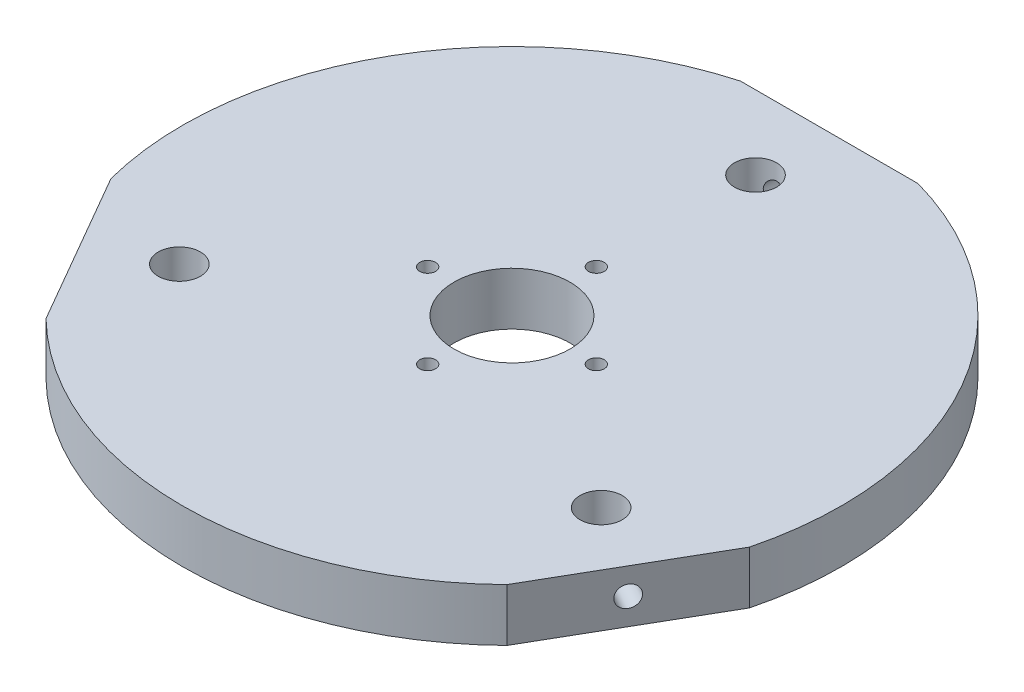
ISO-10303-21;
HEADER;
FILE_DESCRIPTION(('STEP AP214'),'2;1');
FILE_NAME('part.step','',(''),(''),'','','');
FILE_SCHEMA(('AUTOMOTIVE_DESIGN { 1 0 10303 214 1 1 1 1 }'));
ENDSEC;
DATA;
#1=APPLICATION_CONTEXT('core data for automotive mechanical design processes');
#2=APPLICATION_PROTOCOL_DEFINITION('international standard','automotive_design',2000,#1);
#3=PRODUCT_CONTEXT('',#1,'mechanical');
#4=PRODUCT('Part','Part','',(#3));
#5=PRODUCT_RELATED_PRODUCT_CATEGORY('part','',(#4));
#6=PRODUCT_DEFINITION_FORMATION('','',#4);
#7=PRODUCT_DEFINITION_CONTEXT('part definition',#1,'design');
#8=PRODUCT_DEFINITION('design','',#6,#7);
#9=PRODUCT_DEFINITION_SHAPE('','',#8);
#10=(LENGTH_UNIT() NAMED_UNIT(*) SI_UNIT(.MILLI.,.METRE.));
#11=(NAMED_UNIT(*) PLANE_ANGLE_UNIT() SI_UNIT($,.RADIAN.));
#12=(NAMED_UNIT(*) SI_UNIT($,.STERADIAN.) SOLID_ANGLE_UNIT());
#13=UNCERTAINTY_MEASURE_WITH_UNIT(LENGTH_MEASURE(1.E-05),#10,'distance_accuracy_value','');
#14=(GEOMETRIC_REPRESENTATION_CONTEXT(3) GLOBAL_UNCERTAINTY_ASSIGNED_CONTEXT((#13)) GLOBAL_UNIT_ASSIGNED_CONTEXT((#10,
#11,#12)) REPRESENTATION_CONTEXT('',''));
#15=CARTESIAN_POINT('',(0.,0.,0.));
#16=DIRECTION('',(0.,0.,1.));
#17=DIRECTION('',(1.,0.,0.));
#18=AXIS2_PLACEMENT_3D('',#15,#16,#17);
#19=CARTESIAN_POINT('',(0.,10.,0.));
#20=DIRECTION('',(0.,-1.,0.));
#21=DIRECTION('',(0.,0.,-1.));
#22=AXIS2_PLACEMENT_3D('',#19,#20,#21);
#23=CYLINDRICAL_SURFACE('',#22,62.5);
#24=CARTESIAN_POINT('',(0.,10.,0.));
#25=DIRECTION('',(0.,1.,0.));
#26=DIRECTION('',(0.,0.,1.));
#27=AXIS2_PLACEMENT_3D('',#24,#25,#26);
#28=CIRCLE('',#27,62.5);
#29=CARTESIAN_POINT('',(-43.703369017173,10.,44.679587470665));
#30=VERTEX_POINT('',#29);
#31=CARTESIAN_POINT('',(43.703369017173,10.,44.679587470665));
#32=VERTEX_POINT('',#31);
#33=EDGE_CURVE('E106',#30,#32,#28,.T.);
#34=ORIENTED_EDGE('',*,*,#33,.F.);
#35=DIRECTION('',(0.,-1.,0.));
#36=VECTOR('',#35,1.);
#37=CARTESIAN_POINT('',(-43.7033690171729,10.,44.679587470665));
#38=LINE('',#37,#36);
#39=CARTESIAN_POINT('',(-43.703369017173,0.,44.679587470665));
#40=VERTEX_POINT('',#39);
#41=EDGE_CURVE('E11',#30,#40,#38,.T.);
#42=ORIENTED_EDGE('',*,*,#41,.T.);
#43=CARTESIAN_POINT('',(0.,0.,0.));
#44=DIRECTION('',(0.,1.,0.));
#45=DIRECTION('',(0.,0.,1.));
#46=AXIS2_PLACEMENT_3D('',#43,#44,#45);
#47=CIRCLE('',#46,62.5);
#48=CARTESIAN_POINT('',(43.703369017173,0.,44.679587470665));
#49=VERTEX_POINT('',#48);
#50=EDGE_CURVE('E117',#40,#49,#47,.T.);
#51=ORIENTED_EDGE('',*,*,#50,.T.);
#52=DIRECTION('',(0.,-1.,0.));
#53=VECTOR('',#52,1.);
#54=CARTESIAN_POINT('',(43.703369017173,10.,44.679587470665));
#55=LINE('',#54,#53);
#56=EDGE_CURVE('E108',#49,#32,#55,.F.);
#57=ORIENTED_EDGE('',*,*,#56,.T.);
#58=EDGE_LOOP('',(#34,#42,#51,#57));
#59=FACE_BOUND('',#58,.T.);
#60=ADVANCED_FACE('F32',(#59),#23,.T.);
#61=CARTESIAN_POINT('',(-16.8419732716183,0.,-60.1880215351701));
#62=VERTEX_POINT('',#61);
#63=CARTESIAN_POINT('',(-60.5453422887913,0.,15.5084340645051));
#64=VERTEX_POINT('',#63);
#65=EDGE_CURVE('E116',#62,#64,#47,.T.);
#66=ORIENTED_EDGE('',*,*,#65,.T.);
#67=DIRECTION('',(0.,-1.,0.));
#68=VECTOR('',#67,1.);
#69=CARTESIAN_POINT('',(-60.5453422887913,10.,15.508434064505));
#70=LINE('',#69,#68);
#71=CARTESIAN_POINT('',(-60.5453422887913,10.,15.5084340645051));
#72=VERTEX_POINT('',#71);
#73=EDGE_CURVE('E41',#64,#72,#70,.F.);
#74=ORIENTED_EDGE('',*,*,#73,.T.);
#75=CARTESIAN_POINT('',(-16.8419732716183,10.,-60.1880215351701));
#76=VERTEX_POINT('',#75);
#77=EDGE_CURVE('E99',#76,#72,#28,.T.);
#78=ORIENTED_EDGE('',*,*,#77,.F.);
#79=DIRECTION('',(0.,-1.,0.));
#80=VECTOR('',#79,1.);
#81=CARTESIAN_POINT('',(-16.8419732716183,10.,-60.1880215351701));
#82=LINE('',#81,#80);
#83=EDGE_CURVE('E84',#76,#62,#82,.T.);
#84=ORIENTED_EDGE('',*,*,#83,.T.);
#85=EDGE_LOOP('',(#66,#74,#78,#84));
#86=FACE_BOUND('',#85,.T.);
#87=ADVANCED_FACE('F105',(#86),#23,.T.);
#88=CARTESIAN_POINT('',(0.,10.,0.));
#89=DIRECTION('',(0.,1.,0.));
#90=DIRECTION('',(0.,0.,1.));
#91=AXIS2_PLACEMENT_3D('',#88,#89,#90);
#92=PLANE('',#91);
#93=CARTESIAN_POINT('',(0.,10.,-16.));
#94=DIRECTION('',(0.,1.,0.));
#95=DIRECTION('',(0.,0.,1.));
#96=AXIS2_PLACEMENT_3D('',#93,#94,#95);
#97=CIRCLE('',#96,1.5);
#98=CARTESIAN_POINT('',(0.,10.,-14.5));
#99=VERTEX_POINT('',#98);
#100=EDGE_CURVE('E266',#99,#99,#97,.T.);
#101=ORIENTED_EDGE('',*,*,#100,.F.);
#102=EDGE_LOOP('',(#101));
#103=FACE_BOUND('',#102,.T.);
#104=CARTESIAN_POINT('',(16.,10.,1.1172740284298E-13));
#105=DIRECTION('',(0.,1.,0.));
#106=DIRECTION('',(0.,0.,1.));
#107=AXIS2_PLACEMENT_3D('',#104,#105,#106);
#108=CIRCLE('',#107,1.5);
#109=CARTESIAN_POINT('',(16.,10.,1.50000000000011));
#110=VERTEX_POINT('',#109);
#111=EDGE_CURVE('E273',#110,#110,#108,.T.);
#112=ORIENTED_EDGE('',*,*,#111,.F.);
#113=EDGE_LOOP('',(#112));
#114=FACE_BOUND('',#113,.T.);
#115=CARTESIAN_POINT('',(-1.6759110426447E-13,10.,16.));
#116=DIRECTION('',(0.,1.,0.));
#117=DIRECTION('',(0.,0.,1.));
#118=AXIS2_PLACEMENT_3D('',#115,#116,#117);
#119=CIRCLE('',#118,1.5);
#120=CARTESIAN_POINT('',(-1.6759110426447E-13,10.,17.5));
#121=VERTEX_POINT('',#120);
#122=EDGE_CURVE('E281',#121,#121,#119,.T.);
#123=ORIENTED_EDGE('',*,*,#122,.F.);
#124=EDGE_LOOP('',(#123));
#125=FACE_BOUND('',#124,.T.);
#126=CARTESIAN_POINT('',(-16.,10.,0.));
#127=DIRECTION('',(0.,1.,0.));
#128=DIRECTION('',(0.,0.,1.));
#129=AXIS2_PLACEMENT_3D('',#126,#127,#128);
#130=CIRCLE('',#129,1.5);
#131=CARTESIAN_POINT('',(-16.,10.,1.5));
#132=VERTEX_POINT('',#131);
#133=EDGE_CURVE('E270',#132,#132,#130,.T.);
#134=ORIENTED_EDGE('',*,*,#133,.F.);
#135=EDGE_LOOP('',(#134));
#136=FACE_BOUND('',#135,.T.);
#137=CARTESIAN_POINT('',(0.,10.,0.));
#138=DIRECTION('',(0.,1.,0.));
#139=DIRECTION('',(0.,0.,1.));
#140=AXIS2_PLACEMENT_3D('',#137,#138,#139);
#141=CIRCLE('',#140,11.);
#142=CARTESIAN_POINT('',(0.,10.,11.));
#143=VERTEX_POINT('',#142);
#144=EDGE_CURVE('E287',#143,#143,#141,.T.);
#145=ORIENTED_EDGE('',*,*,#144,.F.);
#146=EDGE_LOOP('',(#145));
#147=FACE_BOUND('',#146,.T.);
#148=DIRECTION('',(-0.5,0.,-0.866025403784438));
#149=VECTOR('',#148,1.);
#150=CARTESIAN_POINT('',(-39.5818456053899,10.,51.8182754244579));
#151=LINE('',#150,#149);
#152=EDGE_CURVE('E48',#30,#72,#151,.T.);
#153=ORIENTED_EDGE('',*,*,#152,.F.);
#154=ORIENTED_EDGE('',*,*,#33,.T.);
#155=DIRECTION('',(-0.5,0.,0.866025403784439));
#156=VECTOR('',#155,1.);
#157=CARTESIAN_POINT('',(40.6096525386746,10.,50.0380615956372));
#158=LINE('',#157,#156);
#159=CARTESIAN_POINT('',(60.5453422887913,10.,15.5084340645051));
#160=VERTEX_POINT('',#159);
#161=EDGE_CURVE('E140',#160,#32,#158,.T.);
#162=ORIENTED_EDGE('',*,*,#161,.F.);
#163=CARTESIAN_POINT('',(16.8419732716183,10.,-60.1880215351701));
#164=VERTEX_POINT('',#163);
#165=EDGE_CURVE('E102',#160,#164,#28,.T.);
#166=ORIENTED_EDGE('',*,*,#165,.T.);
#167=DIRECTION('',(1.,0.,0.));
#168=VECTOR('',#167,1.);
#169=CARTESIAN_POINT('',(-21.5150033953902,10.,-60.1880215351701));
#170=LINE('',#169,#168);
#171=EDGE_CURVE('E56',#76,#164,#170,.T.);
#172=ORIENTED_EDGE('',*,*,#171,.F.);
#173=ORIENTED_EDGE('',*,*,#77,.T.);
#174=EDGE_LOOP('',(#153,#154,#162,#166,#172,#173));
#175=FACE_BOUND('',#174,.T.);
#176=CARTESIAN_POINT('',(40.,10.,23.094010767585));
#177=DIRECTION('',(0.,1.,0.));
#178=DIRECTION('',(0.,0.,1.));
#179=AXIS2_PLACEMENT_3D('',#176,#177,#178);
#180=CIRCLE('',#179,4.);
#181=CARTESIAN_POINT('',(40.,10.,27.094010767585));
#182=VERTEX_POINT('',#181);
#183=EDGE_CURVE('E149',#182,#182,#180,.T.);
#184=ORIENTED_EDGE('',*,*,#183,.F.);
#185=EDGE_LOOP('',(#184));
#186=FACE_BOUND('',#185,.T.);
#187=CARTESIAN_POINT('',(0.,10.,-46.1880215351701));
#188=DIRECTION('',(0.,1.,0.));
#189=DIRECTION('',(0.,0.,1.));
#190=AXIS2_PLACEMENT_3D('',#187,#188,#189);
#191=CIRCLE('',#190,4.);
#192=CARTESIAN_POINT('',(0.,10.,-42.1880215351701));
#193=VERTEX_POINT('',#192);
#194=EDGE_CURVE('E153',#193,#193,#191,.T.);
#195=ORIENTED_EDGE('',*,*,#194,.F.);
#196=EDGE_LOOP('',(#195));
#197=FACE_BOUND('',#196,.T.);
#198=CARTESIAN_POINT('',(-40.,10.,23.094010767585));
#199=DIRECTION('',(0.,1.,0.));
#200=DIRECTION('',(0.,0.,1.));
#201=AXIS2_PLACEMENT_3D('',#198,#199,#200);
#202=CIRCLE('',#201,4.);
#203=CARTESIAN_POINT('',(-40.,10.,27.094010767585));
#204=VERTEX_POINT('',#203);
#205=EDGE_CURVE('E143',#204,#204,#202,.T.);
#206=ORIENTED_EDGE('',*,*,#205,.F.);
#207=EDGE_LOOP('',(#206));
#208=FACE_BOUND('',#207,.T.);
#209=ADVANCED_FACE('F97',(#103,#114,#125,#136,#147,#175,#186,#197,#208),#92,.T.);
#210=CARTESIAN_POINT('',(0.,0.,0.));
#211=DIRECTION('',(0.,1.,0.));
#212=DIRECTION('',(0.,0.,1.));
#213=AXIS2_PLACEMENT_3D('',#210,#211,#212);
#214=PLANE('',#213);
#215=CARTESIAN_POINT('',(0.,0.,-16.));
#216=DIRECTION('',(0.,1.,0.));
#217=DIRECTION('',(0.,0.,1.));
#218=AXIS2_PLACEMENT_3D('',#215,#216,#217);
#219=CIRCLE('',#218,1.5);
#220=CARTESIAN_POINT('',(0.,0.,-14.5));
#221=VERTEX_POINT('',#220);
#222=EDGE_CURVE('E263',#221,#221,#219,.T.);
#223=ORIENTED_EDGE('',*,*,#222,.T.);
#224=EDGE_LOOP('',(#223));
#225=FACE_BOUND('',#224,.T.);
#226=CARTESIAN_POINT('',(16.,0.,1.1172740284298E-13));
#227=DIRECTION('',(0.,1.,0.));
#228=DIRECTION('',(0.,0.,1.));
#229=AXIS2_PLACEMENT_3D('',#226,#227,#228);
#230=CIRCLE('',#229,1.5);
#231=CARTESIAN_POINT('',(16.,0.,1.50000000000011));
#232=VERTEX_POINT('',#231);
#233=EDGE_CURVE('E268',#232,#232,#230,.T.);
#234=ORIENTED_EDGE('',*,*,#233,.T.);
#235=EDGE_LOOP('',(#234));
#236=FACE_BOUND('',#235,.T.);
#237=CARTESIAN_POINT('',(-1.6759110426447E-13,0.,16.));
#238=DIRECTION('',(0.,1.,0.));
#239=DIRECTION('',(0.,0.,1.));
#240=AXIS2_PLACEMENT_3D('',#237,#238,#239);
#241=CIRCLE('',#240,1.5);
#242=CARTESIAN_POINT('',(-1.6759110426447E-13,0.,17.5));
#243=VERTEX_POINT('',#242);
#244=EDGE_CURVE('E278',#243,#243,#241,.T.);
#245=ORIENTED_EDGE('',*,*,#244,.T.);
#246=EDGE_LOOP('',(#245));
#247=FACE_BOUND('',#246,.T.);
#248=CARTESIAN_POINT('',(-16.,0.,0.));
#249=DIRECTION('',(0.,1.,0.));
#250=DIRECTION('',(0.,0.,1.));
#251=AXIS2_PLACEMENT_3D('',#248,#249,#250);
#252=CIRCLE('',#251,1.5);
#253=CARTESIAN_POINT('',(-16.,0.,1.5));
#254=VERTEX_POINT('',#253);
#255=EDGE_CURVE('E284',#254,#254,#252,.T.);
#256=ORIENTED_EDGE('',*,*,#255,.T.);
#257=EDGE_LOOP('',(#256));
#258=FACE_BOUND('',#257,.T.);
#259=CARTESIAN_POINT('',(0.,0.,0.));
#260=DIRECTION('',(0.,1.,0.));
#261=DIRECTION('',(0.,0.,1.));
#262=AXIS2_PLACEMENT_3D('',#259,#260,#261);
#263=CIRCLE('',#262,11.);
#264=CARTESIAN_POINT('',(0.,0.,11.));
#265=VERTEX_POINT('',#264);
#266=EDGE_CURVE('E36',#265,#265,#263,.T.);
#267=ORIENTED_EDGE('',*,*,#266,.T.);
#268=EDGE_LOOP('',(#267));
#269=FACE_BOUND('',#268,.T.);
#270=ORIENTED_EDGE('',*,*,#50,.F.);
#271=DIRECTION('',(-0.5,0.,-0.866025403784438));
#272=VECTOR('',#271,1.);
#273=CARTESIAN_POINT('',(-39.5818456053899,0.,51.8182754244579));
#274=LINE('',#273,#272);
#275=EDGE_CURVE('E133',#40,#64,#274,.T.);
#276=ORIENTED_EDGE('',*,*,#275,.T.);
#277=ORIENTED_EDGE('',*,*,#65,.F.);
#278=DIRECTION('',(1.,0.,0.));
#279=VECTOR('',#278,1.);
#280=CARTESIAN_POINT('',(-21.5150033953902,0.,-60.1880215351701));
#281=LINE('',#280,#279);
#282=CARTESIAN_POINT('',(16.8419732716183,0.,-60.1880215351701));
#283=VERTEX_POINT('',#282);
#284=EDGE_CURVE('E87',#62,#283,#281,.T.);
#285=ORIENTED_EDGE('',*,*,#284,.T.);
#286=CARTESIAN_POINT('',(60.5453422887913,0.,15.5084340645051));
#287=VERTEX_POINT('',#286);
#288=EDGE_CURVE('E109',#287,#283,#47,.T.);
#289=ORIENTED_EDGE('',*,*,#288,.F.);
#290=DIRECTION('',(-0.5,0.,0.866025403784439));
#291=VECTOR('',#290,1.);
#292=CARTESIAN_POINT('',(40.6096525386746,0.,50.0380615956372));
#293=LINE('',#292,#291);
#294=EDGE_CURVE('E137',#287,#49,#293,.T.);
#295=ORIENTED_EDGE('',*,*,#294,.T.);
#296=EDGE_LOOP('',(#270,#276,#277,#285,#289,#295));
#297=FACE_BOUND('',#296,.T.);
#298=CARTESIAN_POINT('',(0.,0.,-46.1880215351701));
#299=DIRECTION('',(0.,1.,0.));
#300=DIRECTION('',(0.,0.,1.));
#301=AXIS2_PLACEMENT_3D('',#298,#299,#300);
#302=CIRCLE('',#301,4.);
#303=CARTESIAN_POINT('',(0.,0.,-42.1880215351701));
#304=VERTEX_POINT('',#303);
#305=EDGE_CURVE('E112',#304,#304,#302,.T.);
#306=ORIENTED_EDGE('',*,*,#305,.T.);
#307=EDGE_LOOP('',(#306));
#308=FACE_BOUND('',#307,.T.);
#309=CARTESIAN_POINT('',(40.,0.,23.094010767585));
#310=DIRECTION('',(0.,1.,0.));
#311=DIRECTION('',(0.,0.,1.));
#312=AXIS2_PLACEMENT_3D('',#309,#310,#311);
#313=CIRCLE('',#312,4.);
#314=CARTESIAN_POINT('',(40.,0.,27.094010767585));
#315=VERTEX_POINT('',#314);
#316=EDGE_CURVE('E146',#315,#315,#313,.T.);
#317=ORIENTED_EDGE('',*,*,#316,.T.);
#318=EDGE_LOOP('',(#317));
#319=FACE_BOUND('',#318,.T.);
#320=CARTESIAN_POINT('',(-40.,0.,23.094010767585));
#321=DIRECTION('',(0.,1.,0.));
#322=DIRECTION('',(0.,0.,1.));
#323=AXIS2_PLACEMENT_3D('',#320,#321,#322);
#324=CIRCLE('',#323,4.);
#325=CARTESIAN_POINT('',(-40.,0.,27.094010767585));
#326=VERTEX_POINT('',#325);
#327=EDGE_CURVE('E139',#326,#326,#324,.T.);
#328=ORIENTED_EDGE('',*,*,#327,.T.);
#329=EDGE_LOOP('',(#328));
#330=FACE_BOUND('',#329,.T.);
#331=ADVANCED_FACE('F128',(#225,#236,#247,#258,#269,#297,#308,#319,#330),#214,.F.);
#332=ORIENTED_EDGE('',*,*,#288,.T.);
#333=DIRECTION('',(0.,-1.,0.));
#334=VECTOR('',#333,1.);
#335=CARTESIAN_POINT('',(16.8419732716183,10.,-60.1880215351701));
#336=LINE('',#335,#334);
#337=EDGE_CURVE('E92',#283,#164,#336,.F.);
#338=ORIENTED_EDGE('',*,*,#337,.T.);
#339=ORIENTED_EDGE('',*,*,#165,.F.);
#340=DIRECTION('',(0.,-1.,0.));
#341=VECTOR('',#340,1.);
#342=CARTESIAN_POINT('',(60.5453422887913,10.,15.5084340645051));
#343=LINE('',#342,#341);
#344=EDGE_CURVE('E120',#160,#287,#343,.T.);
#345=ORIENTED_EDGE('',*,*,#344,.T.);
#346=EDGE_LOOP('',(#332,#338,#339,#345));
#347=FACE_BOUND('',#346,.T.);
#348=ADVANCED_FACE('F34',(#347),#23,.T.);
#349=CARTESIAN_POINT('',(0.,10.,-46.1880215351701));
#350=DIRECTION('',(0.,-1.,0.));
#351=DIRECTION('',(0.,0.,-1.));
#352=AXIS2_PLACEMENT_3D('',#349,#350,#351);
#353=CYLINDRICAL_SURFACE('',#352,4.);
#354=CARTESIAN_POINT('',(0.,6.99999902654954,-50.1880215351701));
#355=CARTESIAN_POINT('',(-0.105154302046124,6.99988867358337,-50.1880158046554));
#356=CARTESIAN_POINT('',(-0.210425805028682,6.99144959841584,-50.1838305252787));
#357=CARTESIAN_POINT('',(-0.417841032898264,6.95827271783213,-50.1675044489133));
#358=CARTESIAN_POINT('',(-0.519978423915544,6.93350392429523,-50.1553485266581));
#359=CARTESIAN_POINT('',(-0.717809035632757,6.86887649242144,-50.1243571337957));
#360=CARTESIAN_POINT('',(-0.813525640176034,6.82907655410984,-50.1055476646765));
#361=CARTESIAN_POINT('',(-0.996783723720742,6.7358183253622,-50.062977680625));
#362=CARTESIAN_POINT('',(-1.08432584750757,6.68236111342718,-50.0392175566683));
#363=CARTESIAN_POINT('',(-1.25470988040839,6.55962473421975,-49.987246370732));
#364=CARTESIAN_POINT('',(-1.33694655796384,6.48958373484258,-49.9588529494211));
#365=CARTESIAN_POINT('',(-1.48906292686288,6.33731366271976,-49.9014182315462));
#366=CARTESIAN_POINT('',(-1.55893321692855,6.255075403823,-49.8723764608158));
#367=CARTESIAN_POINT('',(-1.68974363327264,6.07312340594435,-49.8143524412155));
#368=CARTESIAN_POINT('',(-1.74957678964055,5.97255040952973,-49.7855481357408));
#369=CARTESIAN_POINT('',(-1.85122317143853,5.76117467667646,-49.7343202133776));
#370=CARTESIAN_POINT('',(-1.89304935796943,5.65037936806651,-49.7118920110449));
#371=CARTESIAN_POINT('',(-1.95476471998415,5.42850537824439,-49.6780179963748));
#372=CARTESIAN_POINT('',(-1.97582195290929,5.31784450061759,-49.6659928006125));
#373=CARTESIAN_POINT('',(-1.99897706531412,5.09396105037594,-49.6527423068663));
#374=CARTESIAN_POINT('',(-2.00109351580828,4.98074109612704,-49.651506430225));
#375=CARTESIAN_POINT('',(-1.98717376621744,4.76945427098412,-49.6595011157824));
#376=CARTESIAN_POINT('',(-1.97327023388997,4.67118914595109,-49.6675022474208));
#377=CARTESIAN_POINT('',(-1.93138811148992,4.47862979857759,-49.6909217368019));
#378=CARTESIAN_POINT('',(-1.9034050414168,4.3843368505092,-49.7063424553317));
#379=CARTESIAN_POINT('',(-1.8336281314666,4.19965588997426,-49.7432134160094));
#380=CARTESIAN_POINT('',(-1.79152133845649,4.10941429861411,-49.7647984715439));
#381=CARTESIAN_POINT('',(-1.69493118936664,3.93684202998885,-49.8115674227245));
#382=CARTESIAN_POINT('',(-1.64044225559223,3.85451494177032,-49.8367529383421));
#383=CARTESIAN_POINT('',(-1.51259229690195,3.68914134928306,-49.8917345902044));
#384=CARTESIAN_POINT('',(-1.43771562486007,3.60732233825423,-49.9217108503321));
#385=CARTESIAN_POINT('',(-1.27517021563747,3.45689466519605,-49.9803039462177));
#386=CARTESIAN_POINT('',(-1.18749546262126,3.38829225110393,-50.0089201342314));
#387=CARTESIAN_POINT('',(-0.996757218813436,3.26330379012406,-50.063164676838));
#388=CARTESIAN_POINT('',(-0.893173473380936,3.20761955028563,-50.08859664898));
#389=CARTESIAN_POINT('',(-0.67651368738425,3.11492521417948,-50.1319401767942));
#390=CARTESIAN_POINT('',(-0.563445293526094,3.07790024006663,-50.1498577221267));
#391=CARTESIAN_POINT('',(-0.341102650547102,3.02662353876278,-50.1748887523111));
#392=CARTESIAN_POINT('',(-0.232293777388752,3.01073518643682,-50.1827762515958));
#393=CARTESIAN_POINT('',(-0.0132847480325515,2.99705524315953,-50.1894966308161));
#394=CARTESIAN_POINT('',(0.0969147313787748,2.99925516419222,-50.1883337576996));
#395=CARTESIAN_POINT('',(0.306549288858569,3.02073797001262,-50.1775330609323));
#396=CARTESIAN_POINT('',(0.406159467252017,3.03869134128272,-50.1685552406059));
#397=CARTESIAN_POINT('',(0.600751118170068,3.08909183485838,-50.1438680546643));
#398=CARTESIAN_POINT('',(0.695732072353832,3.1215405761149,-50.1281579371439));
#399=CARTESIAN_POINT('',(0.881570096003614,3.20088402347353,-50.0908517742302));
#400=CARTESIAN_POINT('',(0.97222629919881,3.24817218890106,-50.0690975302493));
#401=CARTESIAN_POINT('',(1.14461730385028,3.35540822218643,-50.0217996003671));
#402=CARTESIAN_POINT('',(1.22634826043167,3.4153615136284,-49.996254292418));
#403=CARTESIAN_POINT('',(1.38709329613578,3.55303262144905,-49.9408724553508));
#404=CARTESIAN_POINT('',(1.46504917782608,3.63191780442536,-49.9108609941665));
#405=CARTESIAN_POINT('',(1.6070900759979,3.80172417236467,-49.8517889052623));
#406=CARTESIAN_POINT('',(1.67116551857009,3.89265359551295,-49.8227289454854));
#407=CARTESIAN_POINT('',(1.78651343928048,4.08948613134202,-49.7674991730049));
#408=CARTESIAN_POINT('',(1.83702440814786,4.19589826121915,-49.7415348428901));
#409=CARTESIAN_POINT('',(1.91887463607562,4.41743215593643,-49.6980216790348));
#410=CARTESIAN_POINT('',(1.95023878798833,4.53254239245899,-49.6804619249178));
#411=CARTESIAN_POINT('',(1.98999869569413,4.75629902602436,-49.6579466177749));
#412=CARTESIAN_POINT('',(2.00032152522159,4.86449473547849,-49.6519368123334));
#413=CARTESIAN_POINT('',(2.00325620357227,5.08118775997738,-49.6502426530683));
#414=CARTESIAN_POINT('',(1.99587561592974,5.18968492644641,-49.6545538897243));
#415=CARTESIAN_POINT('',(1.96541110307667,5.39303240007608,-49.6719003764423));
#416=CARTESIAN_POINT('',(1.94388617535925,5.48819973939672,-49.6840676179736));
#417=CARTESIAN_POINT('',(1.8876606705826,5.67346971712604,-49.7147419132441));
#418=CARTESIAN_POINT('',(1.85295585519379,5.76357071561173,-49.7332510061803));
#419=CARTESIAN_POINT('',(1.76871883360886,5.94291278963525,-49.7760578509653));
#420=CARTESIAN_POINT('',(1.71834046442845,6.03168086758936,-49.8006631195905));
#421=CARTESIAN_POINT('',(1.60512698978679,6.20008545800183,-49.8523686190978));
#422=CARTESIAN_POINT('',(1.54228537938948,6.27971716751293,-49.8794701488798));
#423=CARTESIAN_POINT('',(1.39696602025416,6.43765947166475,-49.9370621115803));
#424=CARTESIAN_POINT('',(1.31302958265692,6.51463124693229,-49.9675637894771));
#425=CARTESIAN_POINT('',(1.13257744502538,6.65369545243967,-50.0255001079345));
#426=CARTESIAN_POINT('',(1.03605504047777,6.71577990183674,-50.0529330992391));
#427=CARTESIAN_POINT('',(0.831888725476476,6.82336052277301,-50.1019779185305));
#428=CARTESIAN_POINT('',(0.724174174810472,6.86874195177418,-50.1235492240223));
#429=CARTESIAN_POINT('',(0.501377350169912,6.94015311758525,-50.1580630176187));
#430=CARTESIAN_POINT('',(0.386317048610015,6.96623787605451,-50.1710300286442));
#431=CARTESIAN_POINT('',(0.225067694349083,6.98803200592962,-50.181938193932));
#432=CARTESIAN_POINT('',(0.180212388107334,6.9925521849253,-50.1842135669275));
#433=CARTESIAN_POINT('',(0.0902452562067297,6.99855941874699,-50.1872564877976));
#434=CARTESIAN_POINT('',(0.0451334236230249,7.000046391299,-50.1880239947722));
#435=CARTESIAN_POINT('',(0.,6.99999902654954,-50.1880215351701));
#436=B_SPLINE_CURVE_WITH_KNOTS('',3,(#354,#355,#356,#357,#358,#359,#360,#361,#362,#363,#364,
#365,#366,#367,#368,#369,#370,#371,#372,#373,#374,#375,#376,#377,#378,#379,#380,#381,#382,#383,
#384,#385,#386,#387,#388,#389,#390,#391,#392,#393,#394,#395,#396,#397,#398,#399,#400,#401,#402,
#403,#404,#405,#406,#407,#408,#409,#410,#411,#412,#413,#414,#415,#416,#417,#418,#419,#420,#421,
#422,#423,#424,#425,#426,#427,#428,#429,#430,#431,#432,#433,#434,#435),.UNSPECIFIED.,.T.,.F.,(4,
2,2,2,2,2,2,2,2,2,2,2,2,2,2,2,2,2,2,2,2,2,2,2,2,2,2,2,2,2,2,2,2,2,2,2,2,2,2,2,4),(0.,
0.315279913462393,0.631159847209268,0.94581874432952,1.26045280083257,1.59413132048651,
1.92806243247319,2.2877924218964,2.64726304931999,2.98511419107947,3.32263404099882,
3.619941726569,3.9173440730395,4.22182715841477,4.52644767496464,4.86961905427652,
5.21295226648439,5.57198033063038,5.93072167134478,6.25965488005143,6.58843374395813,
6.89187621671571,7.19535258866687,7.50767365009513,7.82012872880853,8.16332094069498,
8.50674911792877,8.86664983632961,9.22608164431038,9.55077101362719,9.87532168871957,
10.1690292232744,10.4628312870756,10.7765646961837,11.0904622850635,11.4425403307405,
11.7948066996253,12.1494497130425,12.503077573992,12.6383956319451,12.7737173602742),.UNSPECIFIED.);
#437=CARTESIAN_POINT('',(0.,6.99999902654954,-50.1880215351701));
#438=VERTEX_POINT('',#437);
#439=EDGE_CURVE('E226',#438,#438,#436,.T.);
#440=ORIENTED_EDGE('',*,*,#439,.F.);
#441=EDGE_LOOP('',(#440));
#442=FACE_BOUND('',#441,.T.);
#443=ORIENTED_EDGE('',*,*,#194,.T.);
#444=EDGE_LOOP('',(#443));
#445=FACE_BOUND('',#444,.T.);
#446=ORIENTED_EDGE('',*,*,#305,.F.);
#447=EDGE_LOOP('',(#446));
#448=FACE_BOUND('',#447,.T.);
#449=ADVANCED_FACE('F161',(#442,#445,#448),#353,.F.);
#450=CARTESIAN_POINT('',(40.,10.,23.094010767585));
#451=DIRECTION('',(0.,-1.,0.));
#452=DIRECTION('',(0.,0.,-1.));
#453=AXIS2_PLACEMENT_3D('',#450,#451,#452);
#454=CYLINDRICAL_SURFACE('',#453,4.);
#455=CARTESIAN_POINT('',(43.9999993508196,5.,23.0917318549806));
#456=CARTESIAN_POINT('',(44.0000040208065,4.89580584495989,23.0917442689667));
#457=CARTESIAN_POINT('',(44.0000396017128,4.79147589773014,23.1012206592062));
#458=CARTESIAN_POINT('',(43.9997938398625,4.58602118499973,23.1384226699718));
#459=CARTESIAN_POINT('',(43.9995118299616,4.48490362711382,23.1661866552359));
#460=CARTESIAN_POINT('',(43.9975714158878,4.28923130518484,23.2378435144605));
#461=CARTESIAN_POINT('',(43.9959202851037,4.19464471589603,23.2816504757191));
#462=CARTESIAN_POINT('',(43.9898654818001,4.01334218016204,23.3830530123954));
#463=CARTESIAN_POINT('',(43.9854616599671,3.92662666095757,23.4406493356814));
#464=CARTESIAN_POINT('',(43.9718662302023,3.75561455635961,23.5725747628097));
#465=CARTESIAN_POINT('',(43.9623090688776,3.6721099440265,23.6478932567829));
#466=CARTESIAN_POINT('',(43.9363748596702,3.51741103919672,23.8092981645819));
#467=CARTESIAN_POINT('',(43.9199944142003,3.44622290459809,23.8953899278894));
#468=CARTESIAN_POINT('',(43.8773766804248,3.31346059479817,24.0817770073853));
#469=CARTESIAN_POINT('',(43.8505472643465,3.25286329802593,24.1826392858467));
#470=CARTESIAN_POINT('',(43.7858031160598,3.14984198965756,24.3899478089394));
#471=CARTESIAN_POINT('',(43.747895396125,3.10740652384944,24.496390486458));
#472=CARTESIAN_POINT('',(43.6636618722745,3.04504835416254,24.7030902223119));
#473=CARTESIAN_POINT('',(43.6181262364806,3.02373950013498,24.8032489810402));
#474=CARTESIAN_POINT('',(43.517836792334,2.9996763372655,25.0011286876148));
#475=CARTESIAN_POINT('',(43.4630885992711,2.99691076750906,25.0988510790785));
#476=CARTESIAN_POINT('',(43.3513091111817,3.00947973081611,25.2801217967719));
#477=CARTESIAN_POINT('',(43.2948923799497,3.02325818413206,25.3641632342873));
#478=CARTESIAN_POINT('',(43.1778856106857,3.06574045829543,25.5252565062112));
#479=CARTESIAN_POINT('',(43.117295263616,3.09444538541456,25.6023078220514));
#480=CARTESIAN_POINT('',(42.9933866074811,3.16614472110096,25.7490042369657));
#481=CARTESIAN_POINT('',(42.9300423751095,3.20932853085537,25.8185340972846));
#482=CARTESIAN_POINT('',(42.8038346259037,3.3084958515983,25.9482556304472));
#483=CARTESIAN_POINT('',(42.7409712892415,3.36448393831434,26.0084439520667));
#484=CARTESIAN_POINT('',(42.6123354570735,3.49374228554433,26.1245054734953));
#485=CARTESIAN_POINT('',(42.5468485614791,3.56814507325565,26.1794349193108));
#486=CARTESIAN_POINT('',(42.4225058889795,3.72908960949529,26.2779977825905));
#487=CARTESIAN_POINT('',(42.3636552186997,3.81564059273817,26.3216225340632));
#488=CARTESIAN_POINT('',(42.252568899915,4.0051545347666,26.4001952147656));
#489=CARTESIAN_POINT('',(42.2009911043024,4.10881085039049,26.4344157569723));
#490=CARTESIAN_POINT('',(42.1135647323006,4.32567039616703,26.4904156964657));
#491=CARTESIAN_POINT('',(42.0776998170293,4.43886356274051,26.5122080242583));
#492=CARTESIAN_POINT('',(42.0276264298605,4.66218188813136,26.5421298522461));
#493=CARTESIAN_POINT('',(42.0119313421242,4.77184336106111,26.5512024476983));
#494=CARTESIAN_POINT('',(41.9989482489662,4.99258244711148,26.5587295813747));
#495=CARTESIAN_POINT('',(42.0016472567717,5.10365900584661,26.5571916109614));
#496=CARTESIAN_POINT('',(42.0237939915907,5.31114339742736,26.5442828522527));
#497=CARTESIAN_POINT('',(42.0413807783569,5.40782862031393,26.534004027425));
#498=CARTESIAN_POINT('',(42.0893085420097,5.59667366700171,26.5051054317266));
#499=CARTESIAN_POINT('',(42.1196536433682,5.68883201659849,26.4864829634185));
#500=CARTESIAN_POINT('',(42.1925509029147,5.87085061221295,26.4398539978696));
#501=CARTESIAN_POINT('',(42.235602060818,5.96040820530865,26.4114538671823));
#502=CARTESIAN_POINT('',(42.3305653543425,6.13103027103946,26.3454423916555));
#503=CARTESIAN_POINT('',(42.3824820362686,6.21209035149594,26.3078263164888));
#504=CARTESIAN_POINT('',(42.4995190388594,6.37408301931741,26.2178714071568));
#505=CARTESIAN_POINT('',(42.5654787595091,6.45371717960059,26.1642758609396));
#506=CARTESIAN_POINT('',(42.7018534991652,6.59893952743585,26.0449756882382));
#507=CARTESIAN_POINT('',(42.7722700046136,6.6645229964332,25.979267007616));
#508=CARTESIAN_POINT('',(42.9159888788514,6.78123194844033,25.8340293693279));
#509=CARTESIAN_POINT('',(42.9893185224411,6.83193365510545,25.7541834498295));
#510=CARTESIAN_POINT('',(43.1332374187676,6.9143132981648,25.5830427639065));
#511=CARTESIAN_POINT('',(43.2038290253211,6.94600792939175,25.4917581301244));
#512=CARTESIAN_POINT('',(43.3324945825116,6.98674472735709,25.3089184624073));
#513=CARTESIAN_POINT('',(43.3911227959759,6.99759796706851,25.2181561889838));
#514=CARTESIAN_POINT('',(43.5009141810447,7.00168525416604,25.0318631697214));
#515=CARTESIAN_POINT('',(43.5520799489662,6.99492544495953,24.9363340979357));
#516=CARTESIAN_POINT('',(43.6424383972629,6.96517728439905,24.7501088032741));
#517=CARTESIAN_POINT('',(43.6821969374823,6.94328460252047,24.6595075368308));
#518=CARTESIAN_POINT('',(43.7535811160706,6.88537192275876,24.4796501762412));
#519=CARTESIAN_POINT('',(43.7852055831501,6.84934989216296,24.3903942775652));
#520=CARTESIAN_POINT('',(43.841792245159,6.76259009764901,24.2119429175757));
#521=CARTESIAN_POINT('',(43.8664100715779,6.71128688395186,24.1229146088621));
#522=CARTESIAN_POINT('',(43.90802008772,6.5961335314838,23.9514355593177));
#523=CARTESIAN_POINT('',(43.9250087577181,6.53227762099555,23.8689878688605));
#524=CARTESIAN_POINT('',(43.9540021286119,6.38644728461339,23.7051250965161));
#525=CARTESIAN_POINT('',(43.9653417896313,6.3033016469158,23.6246309783291));
#526=CARTESIAN_POINT('',(43.9822955114067,6.12512233006784,23.4772074684624));
#527=CARTESIAN_POINT('',(43.9879045159705,6.03007823567662,23.410290097267));
#528=CARTESIAN_POINT('',(43.9955880045351,5.82666562314926,23.2913968233976));
#529=CARTESIAN_POINT('',(43.997545441657,5.71797142167836,23.2399586850819));
#530=CARTESIAN_POINT('',(43.9991469460488,5.54935967220179,23.1790231817083));
#531=CARTESIAN_POINT('',(43.9994586592276,5.49228161915413,23.1614235949719));
#532=CARTESIAN_POINT('',(43.9998476750174,5.37667918672041,23.1319457916872));
#533=CARTESIAN_POINT('',(43.9999251419361,5.31815585016396,23.1200635697233));
#534=CARTESIAN_POINT('',(43.9999907479377,5.21630972283748,23.1047303501269));
#535=CARTESIAN_POINT('',(43.9999974898924,5.17319527662563,23.0998636159611));
#536=CARTESIAN_POINT('',(44.000000819618,5.08672840863991,23.0933616758334));
#537=CARTESIAN_POINT('',(43.9999974067066,5.04337597106931,23.0917266870448));
#538=CARTESIAN_POINT('',(43.9999993508196,5.,23.0917318549806));
#539=B_SPLINE_CURVE_WITH_KNOTS('',3,(#455,#456,#457,#458,#459,#460,#461,#462,#463,#464,#465,
#466,#467,#468,#469,#470,#471,#472,#473,#474,#475,#476,#477,#478,#479,#480,#481,#482,#483,#484,
#485,#486,#487,#488,#489,#490,#491,#492,#493,#494,#495,#496,#497,#498,#499,#500,#501,#502,#503,
#504,#505,#506,#507,#508,#509,#510,#511,#512,#513,#514,#515,#516,#517,#518,#519,#520,#521,#522,
#523,#524,#525,#526,#527,#528,#529,#530,#531,#532,#533,#534,#535,#536,#537,#538),.UNSPECIFIED.,
.T.,.F.,(4,2,2,2,2,2,2,2,2,2,2,2,2,2,2,2,2,2,2,2,2,2,2,2,2,2,2,2,2,2,2,2,2,2,2,2,2,2,2,2,2,4),
(0.,0.312407118252924,0.625471717927248,0.936883752977537,1.2483126813393,1.58547549417349,
1.92280639498074,2.28296999846834,2.64290611986853,2.97725049980655,3.31139182160765,
3.61641916367055,3.92146911597814,4.23067618247038,4.5399939201282,4.87851217339569,
5.21728916656651,5.57759048112224,5.9375162455347,6.26901710867549,6.60028394670757,
6.89538035490572,7.19057223447705,7.49939581023578,7.80837823116803,8.15622402748689,
8.50418645618354,8.8612646837181,9.21802881106041,9.54207006934891,9.86599831762114,
10.168639264254,10.4713237661751,10.7870048942266,11.1028315130893,11.4501184723539,
11.7977115810451,12.1562667413678,12.3352200860704,12.5140478781863,12.6440940557752,
12.7741489721759),.UNSPECIFIED.);
#540=CARTESIAN_POINT('',(43.9999993508196,5.,23.0917318549806));
#541=VERTEX_POINT('',#540);
#542=EDGE_CURVE('E103',#541,#541,#539,.T.);
#543=ORIENTED_EDGE('',*,*,#542,.F.);
#544=EDGE_LOOP('',(#543));
#545=FACE_BOUND('',#544,.T.);
#546=ORIENTED_EDGE('',*,*,#183,.T.);
#547=EDGE_LOOP('',(#546));
#548=FACE_BOUND('',#547,.T.);
#549=ORIENTED_EDGE('',*,*,#316,.F.);
#550=EDGE_LOOP('',(#549));
#551=FACE_BOUND('',#550,.T.);
#552=ADVANCED_FACE('F163',(#545,#548,#551),#454,.F.);
#553=CARTESIAN_POINT('',(-40.,10.,23.094010767585));
#554=DIRECTION('',(0.,-1.,0.));
#555=DIRECTION('',(0.,0.,-1.));
#556=AXIS2_PLACEMENT_3D('',#553,#554,#555);
#557=CYLINDRICAL_SURFACE('',#556,4.);
#558=CARTESIAN_POINT('',(-42.0019726228648,5.,26.5569727392648));
#559=CARTESIAN_POINT('',(-42.0019856892685,4.89576776918818,26.5569705730593));
#560=CARTESIAN_POINT('',(-42.0102053721022,4.79139979931086,26.5522535592669));
#561=CARTESIAN_POINT('',(-42.0422822214035,4.58586856128783,26.5334012081967));
#562=CARTESIAN_POINT('',(-42.0661722310278,4.48471249277966,26.5192460887319));
#563=CARTESIAN_POINT('',(-42.1272274401488,4.28896256037204,26.4816602515844));
#564=CARTESIAN_POINT('',(-42.1643221344172,4.19433697121372,26.4582787268573));
#565=CARTESIAN_POINT('',(-42.2490736883572,4.01296117508972,26.402218908732));
#566=CARTESIAN_POINT('',(-42.2967311179198,3.92621139340339,26.3695401136914));
#567=CARTESIAN_POINT('',(-42.40412229415,3.75516288263716,26.2916571059408));
#568=CARTESIAN_POINT('',(-42.4645272273229,3.67165386475636,26.2456432200104));
#569=CARTESIAN_POINT('',(-42.5912432462724,3.51695577539082,26.1423125826604));
#570=CARTESIAN_POINT('',(-42.6575572450413,3.44577283175213,26.0849902394183));
#571=CARTESIAN_POINT('',(-42.7975039735378,3.31307117413989,25.9547270963584));
#572=CARTESIAN_POINT('',(-42.8713291719462,3.25252197560001,25.880996159686));
#573=CARTESIAN_POINT('',(-43.0182581542223,3.14959488089618,25.7211514516009));
#574=CARTESIAN_POINT('',(-43.0913623653164,3.10720550217869,25.6350455510862));
#575=CARTESIAN_POINT('',(-43.2279953134532,3.04493316623919,25.4586651475947));
#576=CARTESIAN_POINT('',(-43.2918352203995,3.02366251527511,25.3691240844518));
#577=CARTESIAN_POINT('',(-43.4127924463763,2.99965923042434,25.183295219291));
#578=CARTESIAN_POINT('',(-43.4699138001892,2.99691541393997,25.0870115225238));
#579=CARTESIAN_POINT('',(-43.5707743615595,3.00950692720774,24.8995358721));
#580=CARTESIAN_POINT('',(-43.6152447411284,3.02329382363513,24.8086272713428));
#581=CARTESIAN_POINT('',(-43.6960485571786,3.06578284145939,24.6266993476249));
#582=CARTESIAN_POINT('',(-43.7323813787163,3.09448608951964,24.5356800168188));
#583=CARTESIAN_POINT('',(-43.7972874686196,3.16618545844696,24.3549493558134));
#584=CARTESIAN_POINT('',(-43.8257446036368,3.20937663505824,24.2652743438064));
#585=CARTESIAN_POINT('',(-43.8748146137862,3.30855772792158,24.0910155668403));
#586=CARTESIAN_POINT('',(-43.8954246693487,3.36455223305064,24.0064336410735));
#587=CARTESIAN_POINT('',(-43.9314548335266,3.49383905033315,23.8368879695242));
#588=CARTESIAN_POINT('',(-43.946199059809,3.5682669781837,23.7526458497791));
#589=CARTESIAN_POINT('',(-43.9692267854011,3.72926925354099,23.5955626190986));
#590=CARTESIAN_POINT('',(-43.9775053190533,3.81585287654682,23.5227303051516));
#591=CARTESIAN_POINT('',(-43.9898618680491,4.00543825537734,23.3871486680246));
#592=CARTESIAN_POINT('',(-43.9936399149398,4.10913328545644,23.3253327570063));
#593=CARTESIAN_POINT('',(-43.9983064089578,4.32608039256695,23.2215674445472));
#594=CARTESIAN_POINT('',(-43.9991978893833,4.43932230889669,23.1795972282467));
#595=CARTESIAN_POINT('',(-44.0000060870109,4.66267631200389,23.1212937013047));
#596=CARTESIAN_POINT('',(-43.9999946779256,4.77232124554374,23.1031871907587));
#597=CARTESIAN_POINT('',(-44.000004599558,4.99302299764441,23.088231403414));
#598=CARTESIAN_POINT('',(-44.0000259071127,5.10407876216303,23.0913670927973));
#599=CARTESIAN_POINT('',(-43.9999486269286,5.31147225313372,23.117054469928));
#600=CARTESIAN_POINT('',(-43.9998629230755,5.40808911446373,23.1374406179914));
#601=CARTESIAN_POINT('',(-43.998861886702,5.59679731981578,23.1934144594057));
#602=CARTESIAN_POINT('',(-43.9979462850262,5.6888871854111,23.2290070825931));
#603=CARTESIAN_POINT('',(-43.9941094517498,5.87079444875953,23.3154523426691));
#604=CARTESIAN_POINT('',(-43.9910970309505,5.96030757905535,23.3669370323347));
#605=CARTESIAN_POINT('',(-43.9815409792559,6.13084649462369,23.4821768993785));
#606=CARTESIAN_POINT('',(-43.9749955305344,6.21186788504615,23.5459383825826));
#607=CARTESIAN_POINT('',(-43.9557765839334,6.37383170212467,23.6922870607628));
#608=CARTESIAN_POINT('',(-43.9424333832519,6.45347107931163,23.7762349254561));
#609=CARTESIAN_POINT('',(-43.9074983321441,6.59870909503624,23.9540486071166));
#610=CARTESIAN_POINT('',(-43.8859036870317,6.66430296473568,24.0479177765353));
#611=CARTESIAN_POINT('',(-43.8321882958672,6.78106268666062,24.245112668563));
#612=CARTESIAN_POINT('',(-43.7998029624536,6.83179858546416,24.3486234567636));
#613=CARTESIAN_POINT('',(-43.7237407733916,6.91423815822419,24.5590101334503));
#614=CARTESIAN_POINT('',(-43.6800738868877,6.94595855381071,24.665882978137));
#615=CARTESIAN_POINT('',(-43.5862304147051,6.98672946914808,24.8689183603414));
#616=CARTESIAN_POINT('',(-43.5370191797597,6.9975935002358,24.965163602622));
#617=CARTESIAN_POINT('',(-43.4307235387882,7.00168782841107,25.1535781489095));
#618=CARTESIAN_POINT('',(-43.3736419064901,6.99492432292291,25.2457488738332));
#619=CARTESIAN_POINT('',(-43.2576842193408,6.96515711750349,25.4172654715192));
#620=CARTESIAN_POINT('',(-43.1991759243915,6.9432559813046,25.4970563363494));
#621=CARTESIAN_POINT('',(-43.0792524274385,6.8853202248952,25.6489221805965));
#622=CARTESIAN_POINT('',(-43.0178368110606,6.84928358461659,25.7209960553237));
#623=CARTESIAN_POINT('',(-42.8917463590443,6.76250146170493,25.8593202133999));
#624=CARTESIAN_POINT('',(-42.8270441408156,6.71119474753411,25.9251915813481));
#625=CARTESIAN_POINT('',(-42.6995189743408,6.59603596333329,26.0470412352026));
#626=CARTESIAN_POINT('',(-42.6366969031692,6.53217814026232,26.1030149619009));
#627=CARTESIAN_POINT('',(-42.5094696887805,6.38635950415383,26.2101213579165));
#628=CARTESIAN_POINT('',(-42.4455281955474,6.30323004218118,26.26021934242));
#629=CARTESIAN_POINT('',(-42.3265178604507,6.12509323690688,26.3486725742663));
#630=CARTESIAN_POINT('',(-42.2714568746923,6.03007550720025,26.3870174509744));
#631=CARTESIAN_POINT('',(-42.1724830642877,5.82671654870856,26.4531768720546));
#632=CARTESIAN_POINT('',(-42.1289784799769,5.71804869013802,26.480619503361));
#633=CARTESIAN_POINT('',(-42.0770796955106,5.54948397252304,26.512510841163));
#634=CARTESIAN_POINT('',(-42.0620140439664,5.49242260612365,26.521591823735));
#635=CARTESIAN_POINT('',(-42.0367114070816,5.3768555273005,26.5366880527072));
#636=CARTESIAN_POINT('',(-42.0264710504208,5.31835085344664,26.542705439807));
#637=CARTESIAN_POINT('',(-42.0132291704095,5.21648852223916,26.5504466904969));
#638=CARTESIAN_POINT('',(-42.0090163888558,5.17333846753814,26.5528931520255));
#639=CARTESIAN_POINT('',(-42.0033853010147,5.08680013433949,26.5561566817652));
#640=CARTESIAN_POINT('',(-42.0019671808184,5.04341184017084,26.556973641471));
#641=CARTESIAN_POINT('',(-42.0019726228648,5.,26.5569727392648));
#642=B_SPLINE_CURVE_WITH_KNOTS('',3,(#558,#559,#560,#561,#562,#563,#564,#565,#566,#567,#568,
#569,#570,#571,#572,#573,#574,#575,#576,#577,#578,#579,#580,#581,#582,#583,#584,#585,#586,#587,
#588,#589,#590,#591,#592,#593,#594,#595,#596,#597,#598,#599,#600,#601,#602,#603,#604,#605,#606,
#607,#608,#609,#610,#611,#612,#613,#614,#615,#616,#617,#618,#619,#620,#621,#622,#623,#624,#625,
#626,#627,#628,#629,#630,#631,#632,#633,#634,#635,#636,#637,#638,#639,#640,#641),.UNSPECIFIED.,
.T.,.F.,(4,2,2,2,2,2,2,2,2,2,2,2,2,2,2,2,2,2,2,2,2,2,2,2,2,2,2,2,2,2,2,2,2,2,2,2,2,2,2,2,2,4),
(0.,0.312521296915203,0.625699703556188,0.937230403957417,1.24877791645932,1.58597338868142,
1.92333601764108,2.28334534797039,2.64312670523886,2.97728885680457,3.31124929365186,
3.61622507591891,3.92122389699658,4.23050584772207,4.53989882330348,4.87857639351579,
5.21751381331382,5.57796436386131,5.93803601805686,6.26947574449639,6.6006809244317,
6.89558799595716,7.19059074699535,7.49929686627835,7.80816197375566,8.1560464885152,
8.50404893305415,8.86130351417647,9.21824347435301,9.54242202192805,9.86648661138086,
10.1691393128789,10.4718352814536,10.7874269489385,11.1031636126861,11.4502932618521,
11.7977283331763,12.1561655459654,12.3350613645882,12.5138320068877,12.6439858102552,
12.774148280021),.UNSPECIFIED.);
#643=CARTESIAN_POINT('',(-42.0019726228648,5.,26.5569727392648));
#644=VERTEX_POINT('',#643);
#645=EDGE_CURVE('E217',#644,#644,#642,.T.);
#646=ORIENTED_EDGE('',*,*,#645,.F.);
#647=EDGE_LOOP('',(#646));
#648=FACE_BOUND('',#647,.T.);
#649=ORIENTED_EDGE('',*,*,#205,.T.);
#650=EDGE_LOOP('',(#649));
#651=FACE_BOUND('',#650,.T.);
#652=ORIENTED_EDGE('',*,*,#327,.F.);
#653=EDGE_LOOP('',(#652));
#654=FACE_BOUND('',#653,.T.);
#655=ADVANCED_FACE('F170',(#648,#651,#654),#557,.F.);
#656=CARTESIAN_POINT('',(40.6096525386746,0.,50.0380615956372));
#657=DIRECTION('',(-0.866025403784439,0.,-0.5));
#658=DIRECTION('',(-0.5,0.,0.866025403784439));
#659=AXIS2_PLACEMENT_3D('',#656,#657,#658);
#660=PLANE('',#659);
#661=CARTESIAN_POINT('',(52.1253422887913,5.,30.092301864235));
#662=DIRECTION('',(0.866025403784439,0.,0.5));
#663=DIRECTION('',(0.5,0.,-0.866025403784439));
#664=AXIS2_PLACEMENT_3D('',#661,#662,#663);
#665=CIRCLE('',#664,2.);
#666=CARTESIAN_POINT('',(53.1253422887913,5.,28.3602510566662));
#667=VERTEX_POINT('',#666);
#668=EDGE_CURVE('E192',#667,#667,#665,.T.);
#669=ORIENTED_EDGE('',*,*,#668,.F.);
#670=EDGE_LOOP('',(#669));
#671=FACE_BOUND('',#670,.T.);
#672=ORIENTED_EDGE('',*,*,#161,.T.);
#673=ORIENTED_EDGE('',*,*,#56,.F.);
#674=ORIENTED_EDGE('',*,*,#294,.F.);
#675=ORIENTED_EDGE('',*,*,#344,.F.);
#676=EDGE_LOOP('',(#672,#673,#674,#675));
#677=FACE_BOUND('',#676,.T.);
#678=ADVANCED_FACE('F184',(#671,#677),#660,.F.);
#679=CARTESIAN_POINT('',(-21.5150033953902,0.,-60.1880215351701));
#680=DIRECTION('',(0.,0.,1.));
#681=DIRECTION('',(1.,0.,0.));
#682=AXIS2_PLACEMENT_3D('',#679,#680,#681);
#683=PLANE('',#682);
#684=CARTESIAN_POINT('',(0.00197327161828922,5.,-60.1880215351701));
#685=DIRECTION('',(0.,0.,-1.));
#686=DIRECTION('',(-1.,0.,0.));
#687=AXIS2_PLACEMENT_3D('',#684,#685,#686);
#688=CIRCLE('',#687,2.);
#689=CARTESIAN_POINT('',(-1.99802672838171,5.,-60.1880215351701));
#690=VERTEX_POINT('',#689);
#691=EDGE_CURVE('E232',#690,#690,#688,.T.);
#692=ORIENTED_EDGE('',*,*,#691,.F.);
#693=EDGE_LOOP('',(#692));
#694=FACE_BOUND('',#693,.T.);
#695=ORIENTED_EDGE('',*,*,#171,.T.);
#696=ORIENTED_EDGE('',*,*,#337,.F.);
#697=ORIENTED_EDGE('',*,*,#284,.F.);
#698=ORIENTED_EDGE('',*,*,#83,.F.);
#699=EDGE_LOOP('',(#695,#696,#697,#698));
#700=FACE_BOUND('',#699,.T.);
#701=ADVANCED_FACE('F85',(#694,#700),#683,.F.);
#702=CARTESIAN_POINT('',(-39.5818456053899,0.,51.8182754244579));
#703=DIRECTION('',(0.866025403784438,0.,-0.5));
#704=DIRECTION('',(-0.5,0.,-0.866025403784439));
#705=AXIS2_PLACEMENT_3D('',#702,#703,#704);
#706=PLANE('',#705);
#707=CARTESIAN_POINT('',(-52.1253422887913,5.,30.092301864235));
#708=DIRECTION('',(-0.866025403784438,0.,0.5));
#709=DIRECTION('',(0.5,0.,0.866025403784439));
#710=AXIS2_PLACEMENT_3D('',#707,#708,#709);
#711=CIRCLE('',#710,2.);
#712=CARTESIAN_POINT('',(-51.1253422887913,5.,31.8243526718039));
#713=VERTEX_POINT('',#712);
#714=EDGE_CURVE('E223',#713,#713,#711,.T.);
#715=ORIENTED_EDGE('',*,*,#714,.F.);
#716=EDGE_LOOP('',(#715));
#717=FACE_BOUND('',#716,.T.);
#718=ORIENTED_EDGE('',*,*,#152,.T.);
#719=ORIENTED_EDGE('',*,*,#73,.F.);
#720=ORIENTED_EDGE('',*,*,#275,.F.);
#721=ORIENTED_EDGE('',*,*,#41,.F.);
#722=EDGE_LOOP('',(#718,#719,#720,#721));
#723=FACE_BOUND('',#722,.T.);
#724=ADVANCED_FACE('F202',(#717,#723),#706,.F.);
#725=CARTESIAN_POINT('',(41.733037443378,5.,24.092301864235));
#726=DIRECTION('',(0.866025403784439,0.,0.5));
#727=DIRECTION('',(0.5,0.,-0.866025403784439));
#728=AXIS2_PLACEMENT_3D('',#725,#726,#727);
#729=CYLINDRICAL_SURFACE('',#728,2.);
#730=ORIENTED_EDGE('',*,*,#542,.T.);
#731=EDGE_LOOP('',(#730));
#732=FACE_BOUND('',#731,.T.);
#733=ORIENTED_EDGE('',*,*,#668,.T.);
#734=EDGE_LOOP('',(#733));
#735=FACE_BOUND('',#734,.T.);
#736=ADVANCED_FACE('F196',(#732,#735),#729,.F.);
#737=CARTESIAN_POINT('',(-41.733037443378,5.,24.092301864235));
#738=DIRECTION('',(-0.866025403784439,0.,0.5));
#739=DIRECTION('',(0.5,0.,0.866025403784439));
#740=AXIS2_PLACEMENT_3D('',#737,#738,#739);
#741=CYLINDRICAL_SURFACE('',#740,2.);
#742=ORIENTED_EDGE('',*,*,#645,.T.);
#743=EDGE_LOOP('',(#742));
#744=FACE_BOUND('',#743,.T.);
#745=ORIENTED_EDGE('',*,*,#714,.T.);
#746=EDGE_LOOP('',(#745));
#747=FACE_BOUND('',#746,.T.);
#748=ADVANCED_FACE('F201',(#744,#747),#741,.F.);
#749=CARTESIAN_POINT('',(0.00197327161828922,5.,-48.1880215351701));
#750=DIRECTION('',(0.,0.,-1.));
#751=DIRECTION('',(-1.,0.,0.));
#752=AXIS2_PLACEMENT_3D('',#749,#750,#751);
#753=CYLINDRICAL_SURFACE('',#752,2.);
#754=ORIENTED_EDGE('',*,*,#439,.T.);
#755=EDGE_LOOP('',(#754));
#756=FACE_BOUND('',#755,.T.);
#757=ORIENTED_EDGE('',*,*,#691,.T.);
#758=EDGE_LOOP('',(#757));
#759=FACE_BOUND('',#758,.T.);
#760=ADVANCED_FACE('F234',(#756,#759),#753,.F.);
#761=CARTESIAN_POINT('',(0.,-2.,0.));
#762=DIRECTION('',(0.,1.,0.));
#763=DIRECTION('',(0.,0.,1.));
#764=AXIS2_PLACEMENT_3D('',#761,#762,#763);
#765=CYLINDRICAL_SURFACE('',#764,11.);
#766=ORIENTED_EDGE('',*,*,#144,.T.);
#767=EDGE_LOOP('',(#766));
#768=FACE_BOUND('',#767,.T.);
#769=ORIENTED_EDGE('',*,*,#266,.F.);
#770=EDGE_LOOP('',(#769));
#771=FACE_BOUND('',#770,.T.);
#772=ADVANCED_FACE('F238',(#768,#771),#765,.F.);
#773=CARTESIAN_POINT('',(-16.,0.,0.));
#774=DIRECTION('',(0.,1.,0.));
#775=DIRECTION('',(0.,0.,1.));
#776=AXIS2_PLACEMENT_3D('',#773,#774,#775);
#777=CYLINDRICAL_SURFACE('',#776,1.5);
#778=ORIENTED_EDGE('',*,*,#255,.F.);
#779=EDGE_LOOP('',(#778));
#780=FACE_BOUND('',#779,.T.);
#781=ORIENTED_EDGE('',*,*,#133,.T.);
#782=EDGE_LOOP('',(#781));
#783=FACE_BOUND('',#782,.T.);
#784=ADVANCED_FACE('F242',(#780,#783),#777,.F.);
#785=CARTESIAN_POINT('',(-1.6759110426447E-13,0.,16.));
#786=DIRECTION('',(0.,1.,0.));
#787=DIRECTION('',(0.,0.,1.));
#788=AXIS2_PLACEMENT_3D('',#785,#786,#787);
#789=CYLINDRICAL_SURFACE('',#788,1.5);
#790=ORIENTED_EDGE('',*,*,#244,.F.);
#791=EDGE_LOOP('',(#790));
#792=FACE_BOUND('',#791,.T.);
#793=ORIENTED_EDGE('',*,*,#122,.T.);
#794=EDGE_LOOP('',(#793));
#795=FACE_BOUND('',#794,.T.);
#796=ADVANCED_FACE('F246',(#792,#795),#789,.F.);
#797=CARTESIAN_POINT('',(16.,0.,1.1172740284298E-13));
#798=DIRECTION('',(0.,1.,0.));
#799=DIRECTION('',(0.,0.,1.));
#800=AXIS2_PLACEMENT_3D('',#797,#798,#799);
#801=CYLINDRICAL_SURFACE('',#800,1.5);
#802=ORIENTED_EDGE('',*,*,#233,.F.);
#803=EDGE_LOOP('',(#802));
#804=FACE_BOUND('',#803,.T.);
#805=ORIENTED_EDGE('',*,*,#111,.T.);
#806=EDGE_LOOP('',(#805));
#807=FACE_BOUND('',#806,.T.);
#808=ADVANCED_FACE('F250',(#804,#807),#801,.F.);
#809=CARTESIAN_POINT('',(0.,0.,-16.));
#810=DIRECTION('',(0.,1.,0.));
#811=DIRECTION('',(0.,0.,1.));
#812=AXIS2_PLACEMENT_3D('',#809,#810,#811);
#813=CYLINDRICAL_SURFACE('',#812,1.5);
#814=ORIENTED_EDGE('',*,*,#222,.F.);
#815=EDGE_LOOP('',(#814));
#816=FACE_BOUND('',#815,.T.);
#817=ORIENTED_EDGE('',*,*,#100,.T.);
#818=EDGE_LOOP('',(#817));
#819=FACE_BOUND('',#818,.T.);
#820=ADVANCED_FACE('F254',(#816,#819),#813,.F.);
#821=CLOSED_SHELL('',(#60,#87,#209,#331,#348,#449,#552,#655,#678,#701,#724,#736,#748,#760,#772,
#784,#796,#808,#820));
#822=MANIFOLD_SOLID_BREP('B2',#821);
#823=ADVANCED_BREP_SHAPE_REPRESENTATION('',(#18,#822),#14);
#824=SHAPE_DEFINITION_REPRESENTATION(#9,#823);
ENDSEC;
END-ISO-10303-21;
